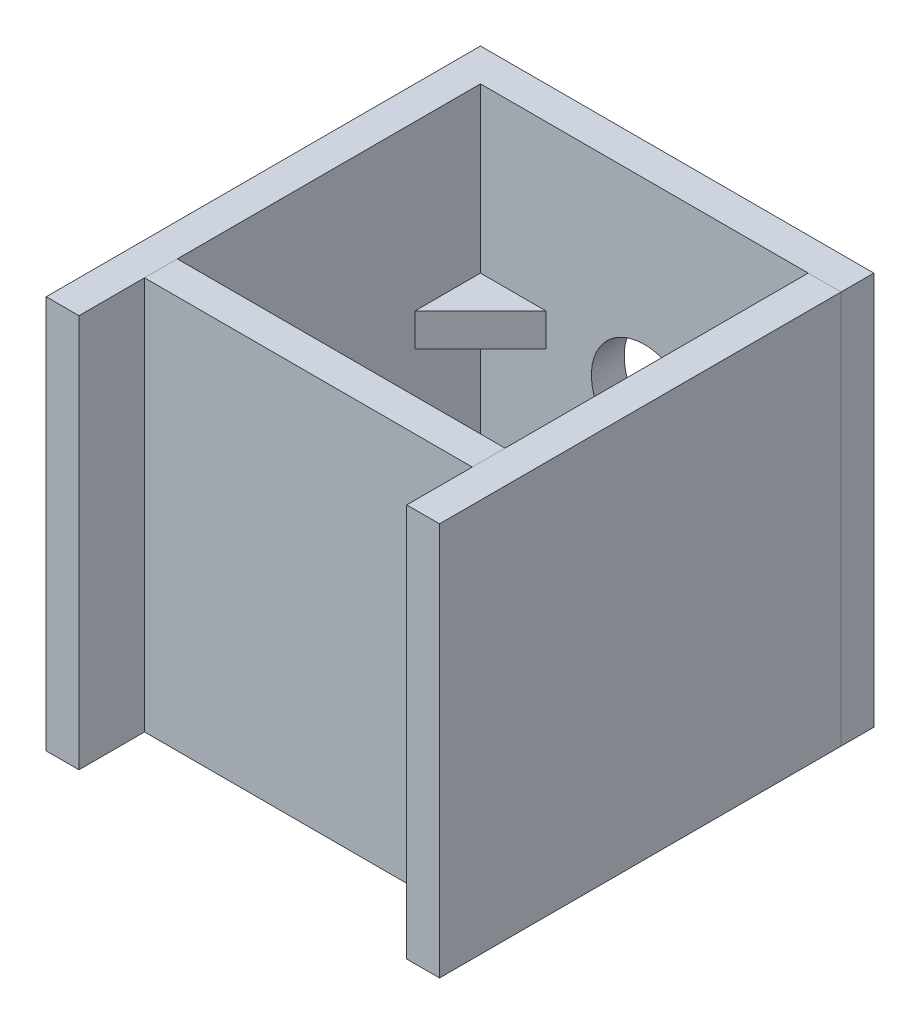
ISO-10303-21;
HEADER;
FILE_DESCRIPTION(('STEP AP214'),'2;1');
FILE_NAME('part.step','',(''),(''),'','','');
FILE_SCHEMA(('AUTOMOTIVE_DESIGN { 1 0 10303 214 1 1 1 1 }'));
ENDSEC;
DATA;
#1=APPLICATION_CONTEXT('core data for automotive mechanical design processes');
#2=APPLICATION_PROTOCOL_DEFINITION('international standard','automotive_design',2000,#1);
#3=PRODUCT_CONTEXT('',#1,'mechanical');
#4=PRODUCT('Part','Part','',(#3));
#5=PRODUCT_RELATED_PRODUCT_CATEGORY('part','',(#4));
#6=PRODUCT_DEFINITION_FORMATION('','',#4);
#7=PRODUCT_DEFINITION_CONTEXT('part definition',#1,'design');
#8=PRODUCT_DEFINITION('design','',#6,#7);
#9=PRODUCT_DEFINITION_SHAPE('','',#8);
#10=(LENGTH_UNIT() NAMED_UNIT(*) SI_UNIT(.MILLI.,.METRE.));
#11=(NAMED_UNIT(*) PLANE_ANGLE_UNIT() SI_UNIT($,.RADIAN.));
#12=(NAMED_UNIT(*) SI_UNIT($,.STERADIAN.) SOLID_ANGLE_UNIT());
#13=UNCERTAINTY_MEASURE_WITH_UNIT(LENGTH_MEASURE(1.E-05),#10,'distance_accuracy_value','');
#14=(GEOMETRIC_REPRESENTATION_CONTEXT(3) GLOBAL_UNCERTAINTY_ASSIGNED_CONTEXT((#13)) GLOBAL_UNIT_ASSIGNED_CONTEXT((#10,
#11,#12)) REPRESENTATION_CONTEXT('',''));
#15=CARTESIAN_POINT('',(0.,0.,0.));
#16=DIRECTION('',(0.,0.,1.));
#17=DIRECTION('',(1.,0.,0.));
#18=AXIS2_PLACEMENT_3D('',#15,#16,#17);
#19=CARTESIAN_POINT('',(-31.75,101.916710194118,65.0875));
#20=DIRECTION('',(0.,0.,1.));
#21=DIRECTION('',(1.,0.,0.));
#22=AXIS2_PLACEMENT_3D('',#19,#20,#21);
#23=PLANE('',#22);
#24=DIRECTION('',(0.,-1.,0.));
#25=VECTOR('',#24,1.);
#26=CARTESIAN_POINT('',(-31.75,101.916710194118,65.0875));
#27=LINE('',#26,#25);
#28=CARTESIAN_POINT('',(-31.75,38.1,65.0875));
#29=VERTEX_POINT('',#28);
#30=CARTESIAN_POINT('',(-31.75,-38.1,65.0875));
#31=VERTEX_POINT('',#30);
#32=EDGE_CURVE('E111',#29,#31,#27,.T.);
#33=ORIENTED_EDGE('',*,*,#32,.F.);
#34=DIRECTION('',(1.,0.,0.));
#35=VECTOR('',#34,1.);
#36=CARTESIAN_POINT('',(-31.75,38.1,65.0875));
#37=LINE('',#36,#35);
#38=CARTESIAN_POINT('',(31.75,38.1,65.0875));
#39=VERTEX_POINT('',#38);
#40=EDGE_CURVE('E53',#29,#39,#37,.T.);
#41=ORIENTED_EDGE('',*,*,#40,.T.);
#42=DIRECTION('',(0.,-1.,0.));
#43=VECTOR('',#42,1.);
#44=CARTESIAN_POINT('',(31.75,101.916710194118,65.0875));
#45=LINE('',#44,#43);
#46=CARTESIAN_POINT('',(31.75,-38.1,65.0875));
#47=VERTEX_POINT('',#46);
#48=EDGE_CURVE('E97',#39,#47,#45,.T.);
#49=ORIENTED_EDGE('',*,*,#48,.T.);
#50=DIRECTION('',(1.,0.,0.));
#51=VECTOR('',#50,1.);
#52=CARTESIAN_POINT('',(-31.75,-38.1,65.0875));
#53=LINE('',#52,#51);
#54=EDGE_CURVE('E107',#31,#47,#53,.T.);
#55=ORIENTED_EDGE('',*,*,#54,.F.);
#56=EDGE_LOOP('',(#33,#41,#49,#55));
#57=FACE_BOUND('',#56,.T.);
#58=ADVANCED_FACE('F49',(#57),#23,.F.);
#59=CARTESIAN_POINT('',(31.75,101.916710194118,65.0875));
#60=DIRECTION('',(-1.,0.,0.));
#61=DIRECTION('',(0.,0.,1.));
#62=AXIS2_PLACEMENT_3D('',#59,#60,#61);
#63=PLANE('',#62);
#64=ORIENTED_EDGE('',*,*,#48,.F.);
#65=DIRECTION('',(0.,0.,1.));
#66=VECTOR('',#65,1.);
#67=CARTESIAN_POINT('',(31.75,38.1,65.0875));
#68=LINE('',#67,#66);
#69=CARTESIAN_POINT('',(31.75,38.1,71.4375));
#70=VERTEX_POINT('',#69);
#71=EDGE_CURVE('E93',#39,#70,#68,.T.);
#72=ORIENTED_EDGE('',*,*,#71,.T.);
#73=DIRECTION('',(0.,-1.,0.));
#74=VECTOR('',#73,1.);
#75=CARTESIAN_POINT('',(31.75,101.916710194118,71.4375));
#76=LINE('',#75,#74);
#77=CARTESIAN_POINT('',(31.75,-38.1000000000001,71.4375));
#78=VERTEX_POINT('',#77);
#79=EDGE_CURVE('E88',#70,#78,#76,.T.);
#80=ORIENTED_EDGE('',*,*,#79,.T.);
#81=DIRECTION('',(0.,0.,1.));
#82=VECTOR('',#81,1.);
#83=CARTESIAN_POINT('',(31.75,-38.1,65.0875));
#84=LINE('',#83,#82);
#85=EDGE_CURVE('E92',#47,#78,#84,.T.);
#86=ORIENTED_EDGE('',*,*,#85,.F.);
#87=EDGE_LOOP('',(#64,#72,#80,#86));
#88=FACE_BOUND('',#87,.T.);
#89=ADVANCED_FACE('F91',(#88),#63,.F.);
#90=CARTESIAN_POINT('',(-31.75,101.916710194118,71.4375));
#91=DIRECTION('',(0.,0.,-1.));
#92=DIRECTION('',(-1.,0.,0.));
#93=AXIS2_PLACEMENT_3D('',#90,#91,#92);
#94=PLANE('',#93);
#95=ORIENTED_EDGE('',*,*,#79,.F.);
#96=DIRECTION('',(-1.,0.,0.));
#97=VECTOR('',#96,1.);
#98=CARTESIAN_POINT('',(-31.75,38.1,71.4375));
#99=LINE('',#98,#97);
#100=CARTESIAN_POINT('',(-31.75,38.1,71.4375));
#101=VERTEX_POINT('',#100);
#102=EDGE_CURVE('E58',#70,#101,#99,.T.);
#103=ORIENTED_EDGE('',*,*,#102,.T.);
#104=DIRECTION('',(0.,-1.,0.));
#105=VECTOR('',#104,1.);
#106=CARTESIAN_POINT('',(-31.75,101.916710194118,71.4375));
#107=LINE('',#106,#105);
#108=CARTESIAN_POINT('',(-31.75,-38.1,71.4375));
#109=VERTEX_POINT('',#108);
#110=EDGE_CURVE('E96',#101,#109,#107,.T.);
#111=ORIENTED_EDGE('',*,*,#110,.T.);
#112=DIRECTION('',(-1.,0.,0.));
#113=VECTOR('',#112,1.);
#114=CARTESIAN_POINT('',(-31.75,-38.1,71.4375));
#115=LINE('',#114,#113);
#116=EDGE_CURVE('E104',#78,#109,#115,.T.);
#117=ORIENTED_EDGE('',*,*,#116,.F.);
#118=EDGE_LOOP('',(#95,#103,#111,#117));
#119=FACE_BOUND('',#118,.T.);
#120=ADVANCED_FACE('F109',(#119),#94,.F.);
#121=CARTESIAN_POINT('',(-31.75,101.916710194118,65.0875));
#122=DIRECTION('',(1.,0.,0.));
#123=DIRECTION('',(0.,0.,-1.));
#124=AXIS2_PLACEMENT_3D('',#121,#122,#123);
#125=PLANE('',#124);
#126=ORIENTED_EDGE('',*,*,#110,.F.);
#127=DIRECTION('',(0.,0.,-1.));
#128=VECTOR('',#127,1.);
#129=CARTESIAN_POINT('',(-31.75,38.1,65.0875));
#130=LINE('',#129,#128);
#131=EDGE_CURVE('E12',#101,#29,#130,.T.);
#132=ORIENTED_EDGE('',*,*,#131,.T.);
#133=ORIENTED_EDGE('',*,*,#32,.T.);
#134=DIRECTION('',(0.,0.,-1.));
#135=VECTOR('',#134,1.);
#136=CARTESIAN_POINT('',(-31.75,-38.1,65.0875));
#137=LINE('',#136,#135);
#138=EDGE_CURVE('E112',#109,#31,#137,.T.);
#139=ORIENTED_EDGE('',*,*,#138,.F.);
#140=EDGE_LOOP('',(#126,#132,#133,#139));
#141=FACE_BOUND('',#140,.T.);
#142=ADVANCED_FACE('F51',(#141),#125,.F.);
#143=CARTESIAN_POINT('',(-38.1,38.1,84.1375));
#144=DIRECTION('',(0.,-1.,0.));
#145=DIRECTION('',(0.,0.,-1.));
#146=AXIS2_PLACEMENT_3D('',#143,#144,#145);
#147=PLANE('',#146);
#148=ORIENTED_EDGE('',*,*,#102,.F.);
#149=ORIENTED_EDGE('',*,*,#71,.F.);
#150=ORIENTED_EDGE('',*,*,#40,.F.);
#151=ORIENTED_EDGE('',*,*,#131,.F.);
#152=EDGE_LOOP('',(#148,#149,#150,#151));
#153=FACE_BOUND('',#152,.T.);
#154=ADVANCED_FACE('F123',(#153),#147,.F.);
#155=CARTESIAN_POINT('',(-38.1,-38.1,84.1375));
#156=DIRECTION('',(0.,1.,0.));
#157=DIRECTION('',(0.,0.,1.));
#158=AXIS2_PLACEMENT_3D('',#155,#156,#157);
#159=PLANE('',#158);
#160=ORIENTED_EDGE('',*,*,#138,.T.);
#161=ORIENTED_EDGE('',*,*,#54,.T.);
#162=ORIENTED_EDGE('',*,*,#85,.T.);
#163=ORIENTED_EDGE('',*,*,#116,.T.);
#164=EDGE_LOOP('',(#160,#161,#162,#163));
#165=FACE_BOUND('',#164,.T.);
#166=ADVANCED_FACE('F103',(#165),#159,.F.);
#167=CLOSED_SHELL('',(#58,#89,#120,#142,#154,#166));
#168=MANIFOLD_SOLID_BREP('B2',#167);
#169=CARTESIAN_POINT('',(38.1,38.1,84.1375));
#170=DIRECTION('',(-1.,0.,0.));
#171=DIRECTION('',(0.,0.,1.));
#172=AXIS2_PLACEMENT_3D('',#169,#170,#171);
#173=PLANE('',#172);
#174=DIRECTION('',(0.,1.,0.));
#175=VECTOR('',#174,1.);
#176=CARTESIAN_POINT('',(38.1,38.1,6.35));
#177=LINE('',#176,#175);
#178=CARTESIAN_POINT('',(38.1,-38.1,6.35));
#179=VERTEX_POINT('',#178);
#180=CARTESIAN_POINT('',(38.1,38.1,6.35));
#181=VERTEX_POINT('',#180);
#182=EDGE_CURVE('E244',#179,#181,#177,.T.);
#183=ORIENTED_EDGE('',*,*,#182,.T.);
#184=DIRECTION('',(0.,0.,-1.));
#185=VECTOR('',#184,1.);
#186=CARTESIAN_POINT('',(38.1,38.1,84.1375));
#187=LINE('',#186,#185);
#188=CARTESIAN_POINT('',(38.1,38.1,84.1375));
#189=VERTEX_POINT('',#188);
#190=EDGE_CURVE('E47',#189,#181,#187,.T.);
#191=ORIENTED_EDGE('',*,*,#190,.F.);
#192=DIRECTION('',(0.,1.,0.));
#193=VECTOR('',#192,1.);
#194=CARTESIAN_POINT('',(38.1,38.1,84.1375));
#195=LINE('',#194,#193);
#196=CARTESIAN_POINT('',(38.1,-38.1,84.1375));
#197=VERTEX_POINT('',#196);
#198=EDGE_CURVE('E232',#197,#189,#195,.T.);
#199=ORIENTED_EDGE('',*,*,#198,.F.);
#200=DIRECTION('',(0.,0.,-1.));
#201=VECTOR('',#200,1.);
#202=CARTESIAN_POINT('',(38.1,-38.1,84.1375));
#203=LINE('',#202,#201);
#204=EDGE_CURVE('E240',#197,#179,#203,.T.);
#205=ORIENTED_EDGE('',*,*,#204,.T.);
#206=EDGE_LOOP('',(#183,#191,#199,#205));
#207=FACE_BOUND('',#206,.T.);
#208=ADVANCED_FACE('F181',(#207),#173,.F.);
#209=CARTESIAN_POINT('',(38.1,38.1,84.1375));
#210=DIRECTION('',(0.,-1.,0.));
#211=DIRECTION('',(1.,0.,0.));
#212=AXIS2_PLACEMENT_3D('',#209,#210,#211);
#213=PLANE('',#212);
#214=DIRECTION('',(-1.,0.,0.));
#215=VECTOR('',#214,1.);
#216=CARTESIAN_POINT('',(38.1,38.1,6.35));
#217=LINE('',#216,#215);
#218=CARTESIAN_POINT('',(31.75,38.1,6.35));
#219=VERTEX_POINT('',#218);
#220=EDGE_CURVE('E236',#181,#219,#217,.T.);
#221=ORIENTED_EDGE('',*,*,#220,.T.);
#222=DIRECTION('',(0.,0.,-1.));
#223=VECTOR('',#222,1.);
#224=CARTESIAN_POINT('',(31.75,38.1,84.1375));
#225=LINE('',#224,#223);
#226=CARTESIAN_POINT('',(31.75,38.1,84.1375));
#227=VERTEX_POINT('',#226);
#228=EDGE_CURVE('E189',#227,#219,#225,.T.);
#229=ORIENTED_EDGE('',*,*,#228,.F.);
#230=DIRECTION('',(-1.,0.,0.));
#231=VECTOR('',#230,1.);
#232=CARTESIAN_POINT('',(38.1,38.1,84.1375));
#233=LINE('',#232,#231);
#234=EDGE_CURVE('E227',#189,#227,#233,.T.);
#235=ORIENTED_EDGE('',*,*,#234,.F.);
#236=ORIENTED_EDGE('',*,*,#190,.T.);
#237=EDGE_LOOP('',(#221,#229,#235,#236));
#238=FACE_BOUND('',#237,.T.);
#239=ADVANCED_FACE('F235',(#238),#213,.F.);
#240=CARTESIAN_POINT('',(31.75,38.1,84.1375));
#241=DIRECTION('',(1.,0.,0.));
#242=DIRECTION('',(0.,1.,0.));
#243=AXIS2_PLACEMENT_3D('',#240,#241,#242);
#244=PLANE('',#243);
#245=DIRECTION('',(0.,-1.,0.));
#246=VECTOR('',#245,1.);
#247=CARTESIAN_POINT('',(31.75,38.1,6.35));
#248=LINE('',#247,#246);
#249=CARTESIAN_POINT('',(31.75,-38.1,6.35));
#250=VERTEX_POINT('',#249);
#251=EDGE_CURVE('E214',#219,#250,#248,.T.);
#252=ORIENTED_EDGE('',*,*,#251,.T.);
#253=DIRECTION('',(0.,0.,-1.));
#254=VECTOR('',#253,1.);
#255=CARTESIAN_POINT('',(31.75,-38.1,84.1375));
#256=LINE('',#255,#254);
#257=CARTESIAN_POINT('',(31.75,-38.1,84.1375));
#258=VERTEX_POINT('',#257);
#259=EDGE_CURVE('E237',#258,#250,#256,.T.);
#260=ORIENTED_EDGE('',*,*,#259,.F.);
#261=DIRECTION('',(0.,-1.,0.));
#262=VECTOR('',#261,1.);
#263=CARTESIAN_POINT('',(31.75,38.1,84.1375));
#264=LINE('',#263,#262);
#265=EDGE_CURVE('E230',#227,#258,#264,.T.);
#266=ORIENTED_EDGE('',*,*,#265,.F.);
#267=ORIENTED_EDGE('',*,*,#228,.T.);
#268=EDGE_LOOP('',(#252,#260,#266,#267));
#269=FACE_BOUND('',#268,.T.);
#270=ADVANCED_FACE('F238',(#269),#244,.F.);
#271=CARTESIAN_POINT('',(38.1,-38.1,84.1375));
#272=DIRECTION('',(0.,1.,0.));
#273=DIRECTION('',(-1.,0.,0.));
#274=AXIS2_PLACEMENT_3D('',#271,#272,#273);
#275=PLANE('',#274);
#276=DIRECTION('',(1.,0.,0.));
#277=VECTOR('',#276,1.);
#278=CARTESIAN_POINT('',(38.1,-38.1,6.35));
#279=LINE('',#278,#277);
#280=EDGE_CURVE('E220',#250,#179,#279,.T.);
#281=ORIENTED_EDGE('',*,*,#280,.T.);
#282=ORIENTED_EDGE('',*,*,#204,.F.);
#283=DIRECTION('',(1.,0.,0.));
#284=VECTOR('',#283,1.);
#285=CARTESIAN_POINT('',(38.1,-38.1,84.1375));
#286=LINE('',#285,#284);
#287=EDGE_CURVE('E197',#258,#197,#286,.T.);
#288=ORIENTED_EDGE('',*,*,#287,.F.);
#289=ORIENTED_EDGE('',*,*,#259,.T.);
#290=EDGE_LOOP('',(#281,#282,#288,#289));
#291=FACE_BOUND('',#290,.T.);
#292=ADVANCED_FACE('F251',(#291),#275,.F.);
#293=CARTESIAN_POINT('',(0.,0.,84.1375));
#294=DIRECTION('',(0.,0.,-1.));
#295=DIRECTION('',(-1.,0.,0.));
#296=AXIS2_PLACEMENT_3D('',#293,#294,#295);
#297=PLANE('',#296);
#298=ORIENTED_EDGE('',*,*,#198,.T.);
#299=ORIENTED_EDGE('',*,*,#234,.T.);
#300=ORIENTED_EDGE('',*,*,#265,.T.);
#301=ORIENTED_EDGE('',*,*,#287,.T.);
#302=EDGE_LOOP('',(#298,#299,#300,#301));
#303=FACE_BOUND('',#302,.T.);
#304=ADVANCED_FACE('F228',(#303),#297,.F.);
#305=CARTESIAN_POINT('',(0.,0.,6.35));
#306=DIRECTION('',(0.,0.,-1.));
#307=DIRECTION('',(-1.,0.,0.));
#308=AXIS2_PLACEMENT_3D('',#305,#306,#307);
#309=PLANE('',#308);
#310=ORIENTED_EDGE('',*,*,#182,.F.);
#311=ORIENTED_EDGE('',*,*,#280,.F.);
#312=ORIENTED_EDGE('',*,*,#251,.F.);
#313=ORIENTED_EDGE('',*,*,#220,.F.);
#314=EDGE_LOOP('',(#310,#311,#312,#313));
#315=FACE_BOUND('',#314,.T.);
#316=ADVANCED_FACE('F254',(#315),#309,.T.);
#317=CLOSED_SHELL('',(#208,#239,#270,#292,#304,#316));
#318=MANIFOLD_SOLID_BREP('B6',#317);
#319=CARTESIAN_POINT('',(-38.1,38.1,84.1375));
#320=DIRECTION('',(1.,0.,0.));
#321=DIRECTION('',(0.,0.,-1.));
#322=AXIS2_PLACEMENT_3D('',#319,#320,#321);
#323=PLANE('',#322);
#324=DIRECTION('',(0.,0.,-1.));
#325=VECTOR('',#324,1.);
#326=CARTESIAN_POINT('',(-38.1,38.1,84.1375));
#327=LINE('',#326,#325);
#328=CARTESIAN_POINT('',(-38.1,38.1,84.1375));
#329=VERTEX_POINT('',#328);
#330=CARTESIAN_POINT('',(-38.1,38.1,0.));
#331=VERTEX_POINT('',#330);
#332=EDGE_CURVE('E461',#329,#331,#327,.T.);
#333=ORIENTED_EDGE('',*,*,#332,.T.);
#334=DIRECTION('',(0.,-1.,0.));
#335=VECTOR('',#334,1.);
#336=CARTESIAN_POINT('',(-38.1,-38.1,0.));
#337=LINE('',#336,#335);
#338=CARTESIAN_POINT('',(-38.1,-38.1,0.));
#339=VERTEX_POINT('',#338);
#340=EDGE_CURVE('E406',#331,#339,#337,.T.);
#341=ORIENTED_EDGE('',*,*,#340,.T.);
#342=DIRECTION('',(0.,0.,-1.));
#343=VECTOR('',#342,1.);
#344=CARTESIAN_POINT('',(-38.1,-38.1,84.1375));
#345=LINE('',#344,#343);
#346=CARTESIAN_POINT('',(-38.1,-38.1,84.1375));
#347=VERTEX_POINT('',#346);
#348=EDGE_CURVE('E179',#347,#339,#345,.T.);
#349=ORIENTED_EDGE('',*,*,#348,.F.);
#350=DIRECTION('',(0.,-1.,0.));
#351=VECTOR('',#350,1.);
#352=CARTESIAN_POINT('',(-38.1,38.1,84.1375));
#353=LINE('',#352,#351);
#354=EDGE_CURVE('E448',#329,#347,#353,.T.);
#355=ORIENTED_EDGE('',*,*,#354,.F.);
#356=EDGE_LOOP('',(#333,#341,#349,#355));
#357=FACE_BOUND('',#356,.T.);
#358=ADVANCED_FACE('F305',(#357),#323,.F.);
#359=CARTESIAN_POINT('',(-38.1,-38.1,84.1375));
#360=DIRECTION('',(0.,1.,0.));
#361=DIRECTION('',(0.,0.,1.));
#362=AXIS2_PLACEMENT_3D('',#359,#360,#361);
#363=PLANE('',#362);
#364=ORIENTED_EDGE('',*,*,#348,.T.);
#365=DIRECTION('',(1.,0.,0.));
#366=VECTOR('',#365,1.);
#367=CARTESIAN_POINT('',(38.1,-38.1,0.));
#368=LINE('',#367,#366);
#369=CARTESIAN_POINT('',(38.1,-38.1,0.));
#370=VERTEX_POINT('',#369);
#371=EDGE_CURVE('E390',#339,#370,#368,.T.);
#372=ORIENTED_EDGE('',*,*,#371,.T.);
#373=DIRECTION('',(0.,0.,-1.));
#374=VECTOR('',#373,1.);
#375=CARTESIAN_POINT('',(38.1,-38.1,6.35));
#376=LINE('',#375,#374);
#377=CARTESIAN_POINT('',(38.1,-38.1,6.35));
#378=VERTEX_POINT('',#377);
#379=EDGE_CURVE('E387',#378,#370,#376,.T.);
#380=ORIENTED_EDGE('',*,*,#379,.F.);
#381=DIRECTION('',(1.,0.,0.));
#382=VECTOR('',#381,1.);
#383=CARTESIAN_POINT('',(38.1,-38.1,6.35));
#384=LINE('',#383,#382);
#385=CARTESIAN_POINT('',(-31.75,-38.1,6.35));
#386=VERTEX_POINT('',#385);
#387=EDGE_CURVE('E373',#386,#378,#384,.T.);
#388=ORIENTED_EDGE('',*,*,#387,.F.);
#389=DIRECTION('',(0.,0.,-1.));
#390=VECTOR('',#389,1.);
#391=CARTESIAN_POINT('',(-31.75,-38.1,84.1375));
#392=LINE('',#391,#390);
#393=CARTESIAN_POINT('',(-31.75,-38.1,84.1375));
#394=VERTEX_POINT('',#393);
#395=EDGE_CURVE('E313',#394,#386,#392,.T.);
#396=ORIENTED_EDGE('',*,*,#395,.F.);
#397=DIRECTION('',(1.,0.,0.));
#398=VECTOR('',#397,1.);
#399=CARTESIAN_POINT('',(-38.1,-38.1,84.1375));
#400=LINE('',#399,#398);
#401=EDGE_CURVE('E452',#347,#394,#400,.T.);
#402=ORIENTED_EDGE('',*,*,#401,.F.);
#403=EDGE_LOOP('',(#364,#372,#380,#388,#396,#402));
#404=FACE_BOUND('',#403,.T.);
#405=ADVANCED_FACE('F388',(#404),#363,.F.);
#406=CARTESIAN_POINT('',(-31.75,38.1,84.1375));
#407=DIRECTION('',(-1.,0.,0.));
#408=DIRECTION('',(0.,-1.,0.));
#409=AXIS2_PLACEMENT_3D('',#406,#407,#408);
#410=PLANE('',#409);
#411=DIRECTION('',(0.,1.,0.));
#412=VECTOR('',#411,1.);
#413=CARTESIAN_POINT('',(-31.75,38.1,6.35));
#414=LINE('',#413,#412);
#415=CARTESIAN_POINT('',(-31.75,0.,6.35));
#416=VERTEX_POINT('',#415);
#417=EDGE_CURVE('E379',#386,#416,#414,.T.);
#418=ORIENTED_EDGE('',*,*,#417,.T.);
#419=DIRECTION('',(0.,0.,1.));
#420=VECTOR('',#419,1.);
#421=CARTESIAN_POINT('',(-31.75,0.,19.05));
#422=LINE('',#421,#420);
#423=CARTESIAN_POINT('',(-31.75,0.,19.05));
#424=VERTEX_POINT('',#423);
#425=EDGE_CURVE('E320',#416,#424,#422,.T.);
#426=ORIENTED_EDGE('',*,*,#425,.T.);
#427=DIRECTION('',(0.,-1.,0.));
#428=VECTOR('',#427,1.);
#429=CARTESIAN_POINT('',(-31.75,6.35,19.05));
#430=LINE('',#429,#428);
#431=CARTESIAN_POINT('',(-31.75,6.35,19.05));
#432=VERTEX_POINT('',#431);
#433=EDGE_CURVE('E444',#432,#424,#430,.T.);
#434=ORIENTED_EDGE('',*,*,#433,.F.);
#435=DIRECTION('',(0.,0.,1.));
#436=VECTOR('',#435,1.);
#437=CARTESIAN_POINT('',(-31.75,6.35,19.05));
#438=LINE('',#437,#436);
#439=CARTESIAN_POINT('',(-31.75,6.35000000000002,6.35));
#440=VERTEX_POINT('',#439);
#441=EDGE_CURVE('E425',#440,#432,#438,.T.);
#442=ORIENTED_EDGE('',*,*,#441,.F.);
#443=CARTESIAN_POINT('',(-31.75,38.1,6.35));
#444=VERTEX_POINT('',#443);
#445=EDGE_CURVE('E447',#440,#444,#414,.T.);
#446=ORIENTED_EDGE('',*,*,#445,.T.);
#447=DIRECTION('',(0.,0.,-1.));
#448=VECTOR('',#447,1.);
#449=CARTESIAN_POINT('',(-31.75,38.1,84.1375));
#450=LINE('',#449,#448);
#451=CARTESIAN_POINT('',(-31.75,38.1,84.1375));
#452=VERTEX_POINT('',#451);
#453=EDGE_CURVE('E466',#452,#444,#450,.T.);
#454=ORIENTED_EDGE('',*,*,#453,.F.);
#455=DIRECTION('',(0.,1.,0.));
#456=VECTOR('',#455,1.);
#457=CARTESIAN_POINT('',(-31.75,38.1,84.1375));
#458=LINE('',#457,#456);
#459=EDGE_CURVE('E455',#394,#452,#458,.T.);
#460=ORIENTED_EDGE('',*,*,#459,.F.);
#461=ORIENTED_EDGE('',*,*,#395,.T.);
#462=EDGE_LOOP('',(#418,#426,#434,#442,#446,#454,#460,#461));
#463=FACE_BOUND('',#462,.T.);
#464=ADVANCED_FACE('F471',(#463),#410,.F.);
#465=CARTESIAN_POINT('',(-38.1,38.1,84.1375));
#466=DIRECTION('',(0.,-1.,0.));
#467=DIRECTION('',(0.,0.,-1.));
#468=AXIS2_PLACEMENT_3D('',#465,#466,#467);
#469=PLANE('',#468);
#470=ORIENTED_EDGE('',*,*,#453,.T.);
#471=DIRECTION('',(-1.,0.,0.));
#472=VECTOR('',#471,1.);
#473=CARTESIAN_POINT('',(38.1,38.1,6.35));
#474=LINE('',#473,#472);
#475=CARTESIAN_POINT('',(38.1,38.1,6.35));
#476=VERTEX_POINT('',#475);
#477=EDGE_CURVE('E400',#476,#444,#474,.T.);
#478=ORIENTED_EDGE('',*,*,#477,.F.);
#479=DIRECTION('',(0.,0.,-1.));
#480=VECTOR('',#479,1.);
#481=CARTESIAN_POINT('',(38.1,38.1,6.35));
#482=LINE('',#481,#480);
#483=CARTESIAN_POINT('',(38.1,38.1,0.));
#484=VERTEX_POINT('',#483);
#485=EDGE_CURVE('E394',#476,#484,#482,.T.);
#486=ORIENTED_EDGE('',*,*,#485,.T.);
#487=DIRECTION('',(-1.,0.,0.));
#488=VECTOR('',#487,1.);
#489=CARTESIAN_POINT('',(38.1,38.1,0.));
#490=LINE('',#489,#488);
#491=EDGE_CURVE('E384',#484,#331,#490,.T.);
#492=ORIENTED_EDGE('',*,*,#491,.T.);
#493=ORIENTED_EDGE('',*,*,#332,.F.);
#494=DIRECTION('',(-1.,0.,0.));
#495=VECTOR('',#494,1.);
#496=CARTESIAN_POINT('',(-38.1,38.1,84.1375));
#497=LINE('',#496,#495);
#498=EDGE_CURVE('E458',#452,#329,#497,.T.);
#499=ORIENTED_EDGE('',*,*,#498,.F.);
#500=EDGE_LOOP('',(#470,#478,#486,#492,#493,#499));
#501=FACE_BOUND('',#500,.T.);
#502=ADVANCED_FACE('F485',(#501),#469,.F.);
#503=CARTESIAN_POINT('',(0.,0.,84.1375));
#504=DIRECTION('',(0.,0.,1.));
#505=DIRECTION('',(1.,0.,0.));
#506=AXIS2_PLACEMENT_3D('',#503,#504,#505);
#507=PLANE('',#506);
#508=ORIENTED_EDGE('',*,*,#354,.T.);
#509=ORIENTED_EDGE('',*,*,#401,.T.);
#510=ORIENTED_EDGE('',*,*,#459,.T.);
#511=ORIENTED_EDGE('',*,*,#498,.T.);
#512=EDGE_LOOP('',(#508,#509,#510,#511));
#513=FACE_BOUND('',#512,.T.);
#514=ADVANCED_FACE('F476',(#513),#507,.T.);
#515=CARTESIAN_POINT('',(-19.05,6.35,6.35));
#516=DIRECTION('',(-0.707106781186547,0.,-0.707106781186548));
#517=DIRECTION('',(-0.707106781186548,0.,0.707106781186547));
#518=AXIS2_PLACEMENT_3D('',#515,#516,#517);
#519=PLANE('',#518);
#520=DIRECTION('',(0.707106781186548,0.,-0.707106781186547));
#521=VECTOR('',#520,1.);
#522=CARTESIAN_POINT('',(-19.05,0.,6.35));
#523=LINE('',#522,#521);
#524=CARTESIAN_POINT('',(-19.05,0.,6.35));
#525=VERTEX_POINT('',#524);
#526=EDGE_CURVE('E426',#424,#525,#523,.T.);
#527=ORIENTED_EDGE('',*,*,#526,.T.);
#528=DIRECTION('',(0.,-1.,0.));
#529=VECTOR('',#528,1.);
#530=CARTESIAN_POINT('',(-19.05,6.35,6.35));
#531=LINE('',#530,#529);
#532=CARTESIAN_POINT('',(-19.05,6.35,6.35));
#533=VERTEX_POINT('',#532);
#534=EDGE_CURVE('E434',#533,#525,#531,.T.);
#535=ORIENTED_EDGE('',*,*,#534,.F.);
#536=DIRECTION('',(0.707106781186548,0.,-0.707106781186547));
#537=VECTOR('',#536,1.);
#538=CARTESIAN_POINT('',(-19.05,6.35,6.35));
#539=LINE('',#538,#537);
#540=EDGE_CURVE('E430',#432,#533,#539,.T.);
#541=ORIENTED_EDGE('',*,*,#540,.F.);
#542=ORIENTED_EDGE('',*,*,#433,.T.);
#543=EDGE_LOOP('',(#527,#535,#541,#542));
#544=FACE_BOUND('',#543,.T.);
#545=ADVANCED_FACE('F495',(#544),#519,.F.);
#546=CARTESIAN_POINT('',(0.,6.35,0.));
#547=DIRECTION('',(0.,1.,0.));
#548=DIRECTION('',(0.,0.,1.));
#549=AXIS2_PLACEMENT_3D('',#546,#547,#548);
#550=PLANE('',#549);
#551=DIRECTION('',(-1.,0.,0.));
#552=VECTOR('',#551,1.);
#553=CARTESIAN_POINT('',(-31.75,6.35,6.35));
#554=LINE('',#553,#552);
#555=EDGE_CURVE('E421',#533,#440,#554,.T.);
#556=ORIENTED_EDGE('',*,*,#555,.T.);
#557=ORIENTED_EDGE('',*,*,#441,.T.);
#558=ORIENTED_EDGE('',*,*,#540,.T.);
#559=EDGE_LOOP('',(#556,#557,#558));
#560=FACE_BOUND('',#559,.T.);
#561=ADVANCED_FACE('F491',(#560),#550,.T.);
#562=CARTESIAN_POINT('',(0.,0.,0.));
#563=DIRECTION('',(0.,1.,0.));
#564=DIRECTION('',(0.,0.,1.));
#565=AXIS2_PLACEMENT_3D('',#562,#563,#564);
#566=PLANE('',#565);
#567=DIRECTION('',(-1.,0.,0.));
#568=VECTOR('',#567,1.);
#569=CARTESIAN_POINT('',(-31.75,0.,6.35));
#570=LINE('',#569,#568);
#571=EDGE_CURVE('E328',#525,#416,#570,.T.);
#572=ORIENTED_EDGE('',*,*,#571,.F.);
#573=ORIENTED_EDGE('',*,*,#526,.F.);
#574=ORIENTED_EDGE('',*,*,#425,.F.);
#575=EDGE_LOOP('',(#572,#573,#574));
#576=FACE_BOUND('',#575,.T.);
#577=ADVANCED_FACE('F497',(#576),#566,.F.);
#578=CARTESIAN_POINT('',(0.,0.,6.35));
#579=DIRECTION('',(0.,0.,1.));
#580=DIRECTION('',(1.,0.,0.));
#581=AXIS2_PLACEMENT_3D('',#578,#579,#580);
#582=PLANE('',#581);
#583=CARTESIAN_POINT('',(0.,0.,6.35));
#584=DIRECTION('',(0.,0.,1.));
#585=DIRECTION('',(1.,0.,0.));
#586=AXIS2_PLACEMENT_3D('',#583,#584,#585);
#587=CIRCLE('',#586,10.2616);
#588=CARTESIAN_POINT('',(10.2616,0.,6.35));
#589=VERTEX_POINT('',#588);
#590=EDGE_CURVE('E608',#589,#589,#587,.T.);
#591=ORIENTED_EDGE('',*,*,#590,.F.);
#592=EDGE_LOOP('',(#591));
#593=FACE_BOUND('',#592,.T.);
#594=ORIENTED_EDGE('',*,*,#445,.F.);
#595=ORIENTED_EDGE('',*,*,#555,.F.);
#596=ORIENTED_EDGE('',*,*,#534,.T.);
#597=ORIENTED_EDGE('',*,*,#571,.T.);
#598=ORIENTED_EDGE('',*,*,#417,.F.);
#599=ORIENTED_EDGE('',*,*,#387,.T.);
#600=DIRECTION('',(0.,1.,0.));
#601=VECTOR('',#600,1.);
#602=CARTESIAN_POINT('',(38.1,-38.1,6.35));
#603=LINE('',#602,#601);
#604=EDGE_CURVE('E377',#378,#476,#603,.T.);
#605=ORIENTED_EDGE('',*,*,#604,.T.);
#606=ORIENTED_EDGE('',*,*,#477,.T.);
#607=EDGE_LOOP('',(#594,#595,#596,#597,#598,#599,#605,#606));
#608=FACE_BOUND('',#607,.T.);
#609=ADVANCED_FACE('F375',(#593,#608),#582,.T.);
#610=CARTESIAN_POINT('',(38.1,-38.1,6.35));
#611=DIRECTION('',(-1.,0.,0.));
#612=DIRECTION('',(0.,0.,1.));
#613=AXIS2_PLACEMENT_3D('',#610,#611,#612);
#614=PLANE('',#613);
#615=DIRECTION('',(0.,1.,0.));
#616=VECTOR('',#615,1.);
#617=CARTESIAN_POINT('',(38.1,-38.1,0.));
#618=LINE('',#617,#616);
#619=EDGE_CURVE('E413',#370,#484,#618,.T.);
#620=ORIENTED_EDGE('',*,*,#619,.T.);
#621=ORIENTED_EDGE('',*,*,#485,.F.);
#622=ORIENTED_EDGE('',*,*,#604,.F.);
#623=ORIENTED_EDGE('',*,*,#379,.T.);
#624=EDGE_LOOP('',(#620,#621,#622,#623));
#625=FACE_BOUND('',#624,.T.);
#626=ADVANCED_FACE('F396',(#625),#614,.F.);
#627=CARTESIAN_POINT('',(0.,0.,0.));
#628=DIRECTION('',(0.,0.,1.));
#629=DIRECTION('',(1.,0.,0.));
#630=AXIS2_PLACEMENT_3D('',#627,#628,#629);
#631=PLANE('',#630);
#632=CARTESIAN_POINT('',(0.,0.,0.));
#633=DIRECTION('',(0.,0.,1.));
#634=DIRECTION('',(1.,0.,0.));
#635=AXIS2_PLACEMENT_3D('',#632,#633,#634);
#636=CIRCLE('',#635,10.2616);
#637=CARTESIAN_POINT('',(10.2616,0.,0.));
#638=VERTEX_POINT('',#637);
#639=EDGE_CURVE('E410',#638,#638,#636,.T.);
#640=ORIENTED_EDGE('',*,*,#639,.T.);
#641=EDGE_LOOP('',(#640));
#642=FACE_BOUND('',#641,.T.);
#643=ORIENTED_EDGE('',*,*,#340,.F.);
#644=ORIENTED_EDGE('',*,*,#491,.F.);
#645=ORIENTED_EDGE('',*,*,#619,.F.);
#646=ORIENTED_EDGE('',*,*,#371,.F.);
#647=EDGE_LOOP('',(#643,#644,#645,#646));
#648=FACE_BOUND('',#647,.T.);
#649=ADVANCED_FACE('F483',(#642,#648),#631,.F.);
#650=CARTESIAN_POINT('',(0.,0.,0.));
#651=DIRECTION('',(0.,0.,1.));
#652=DIRECTION('',(1.,0.,0.));
#653=AXIS2_PLACEMENT_3D('',#650,#651,#652);
#654=CYLINDRICAL_SURFACE('',#653,10.2616);
#655=ORIENTED_EDGE('',*,*,#639,.F.);
#656=EDGE_LOOP('',(#655));
#657=FACE_BOUND('',#656,.T.);
#658=ORIENTED_EDGE('',*,*,#590,.T.);
#659=EDGE_LOOP('',(#658));
#660=FACE_BOUND('',#659,.T.);
#661=ADVANCED_FACE('F528',(#657,#660),#654,.F.);
#662=CLOSED_SHELL('',(#358,#405,#464,#502,#514,#545,#561,#577,#609,#626,#649,#661));
#663=MANIFOLD_SOLID_BREP('B41',#662);
#664=ADVANCED_BREP_SHAPE_REPRESENTATION('',(#18,#168,#318,#663),#14);
#665=SHAPE_DEFINITION_REPRESENTATION(#9,#664);
ENDSEC;
END-ISO-10303-21;
